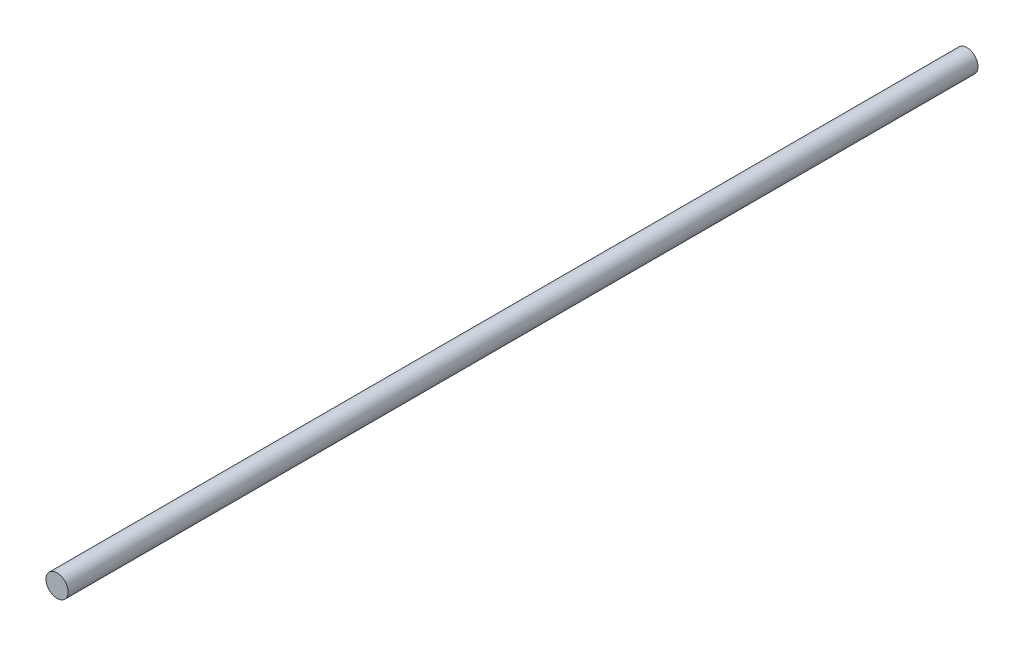
ISO-10303-21;
HEADER;
FILE_DESCRIPTION(('STEP AP214'),'2;1');
FILE_NAME('part.step','',(''),(''),'','','');
FILE_SCHEMA(('AUTOMOTIVE_DESIGN { 1 0 10303 214 1 1 1 1 }'));
ENDSEC;
DATA;
#1=APPLICATION_CONTEXT('core data for automotive mechanical design processes');
#2=APPLICATION_PROTOCOL_DEFINITION('international standard','automotive_design',2000,#1);
#3=PRODUCT_CONTEXT('',#1,'mechanical');
#4=PRODUCT('Part','Part','',(#3));
#5=PRODUCT_RELATED_PRODUCT_CATEGORY('part','',(#4));
#6=PRODUCT_DEFINITION_FORMATION('','',#4);
#7=PRODUCT_DEFINITION_CONTEXT('part definition',#1,'design');
#8=PRODUCT_DEFINITION('design','',#6,#7);
#9=PRODUCT_DEFINITION_SHAPE('','',#8);
#10=(LENGTH_UNIT() NAMED_UNIT(*) SI_UNIT(.MILLI.,.METRE.));
#11=(NAMED_UNIT(*) PLANE_ANGLE_UNIT() SI_UNIT($,.RADIAN.));
#12=(NAMED_UNIT(*) SI_UNIT($,.STERADIAN.) SOLID_ANGLE_UNIT());
#13=UNCERTAINTY_MEASURE_WITH_UNIT(LENGTH_MEASURE(1.E-05),#10,'distance_accuracy_value','');
#14=(GEOMETRIC_REPRESENTATION_CONTEXT(3) GLOBAL_UNCERTAINTY_ASSIGNED_CONTEXT((#13)) GLOBAL_UNIT_ASSIGNED_CONTEXT((#10,
#11,#12)) REPRESENTATION_CONTEXT('',''));
#15=CARTESIAN_POINT('',(0.,0.,0.));
#16=DIRECTION('',(0.,0.,1.));
#17=DIRECTION('',(1.,0.,0.));
#18=AXIS2_PLACEMENT_3D('',#15,#16,#17);
#19=CARTESIAN_POINT('',(0.,0.,82.));
#20=DIRECTION('',(0.,0.,-1.));
#21=DIRECTION('',(-1.,0.,0.));
#22=AXIS2_PLACEMENT_3D('',#19,#20,#21);
#23=CYLINDRICAL_SURFACE('',#22,2.);
#24=CARTESIAN_POINT('',(0.,0.,82.));
#25=DIRECTION('',(0.,0.,1.));
#26=DIRECTION('',(1.,0.,0.));
#27=AXIS2_PLACEMENT_3D('',#24,#25,#26);
#28=CIRCLE('',#27,2.);
#29=CARTESIAN_POINT('',(2.,0.,82.));
#30=VERTEX_POINT('',#29);
#31=EDGE_CURVE('E10',#30,#30,#28,.T.);
#32=ORIENTED_EDGE('',*,*,#31,.F.);
#33=EDGE_LOOP('',(#32));
#34=FACE_BOUND('',#33,.T.);
#35=CARTESIAN_POINT('',(0.,0.,-82.));
#36=DIRECTION('',(0.,0.,1.));
#37=DIRECTION('',(1.,0.,0.));
#38=AXIS2_PLACEMENT_3D('',#35,#36,#37);
#39=CIRCLE('',#38,2.);
#40=CARTESIAN_POINT('',(2.,0.,-82.));
#41=VERTEX_POINT('',#40);
#42=EDGE_CURVE('E33',#41,#41,#39,.T.);
#43=ORIENTED_EDGE('',*,*,#42,.T.);
#44=EDGE_LOOP('',(#43));
#45=FACE_BOUND('',#44,.T.);
#46=ADVANCED_FACE('F30',(#34,#45),#23,.T.);
#47=CARTESIAN_POINT('',(0.,0.,82.));
#48=DIRECTION('',(0.,0.,1.));
#49=DIRECTION('',(1.,0.,0.));
#50=AXIS2_PLACEMENT_3D('',#47,#48,#49);
#51=PLANE('',#50);
#52=ORIENTED_EDGE('',*,*,#31,.T.);
#53=EDGE_LOOP('',(#52));
#54=FACE_BOUND('',#53,.T.);
#55=ADVANCED_FACE('F45',(#54),#51,.T.);
#56=CARTESIAN_POINT('',(0.,0.,-82.));
#57=DIRECTION('',(0.,0.,1.));
#58=DIRECTION('',(1.,0.,0.));
#59=AXIS2_PLACEMENT_3D('',#56,#57,#58);
#60=PLANE('',#59);
#61=ORIENTED_EDGE('',*,*,#42,.F.);
#62=EDGE_LOOP('',(#61));
#63=FACE_BOUND('',#62,.T.);
#64=ADVANCED_FACE('F43',(#63),#60,.F.);
#65=CLOSED_SHELL('',(#46,#55,#64));
#66=MANIFOLD_SOLID_BREP('B2',#65);
#67=ADVANCED_BREP_SHAPE_REPRESENTATION('',(#18,#66),#14);
#68=SHAPE_DEFINITION_REPRESENTATION(#9,#67);
ENDSEC;
END-ISO-10303-21;
